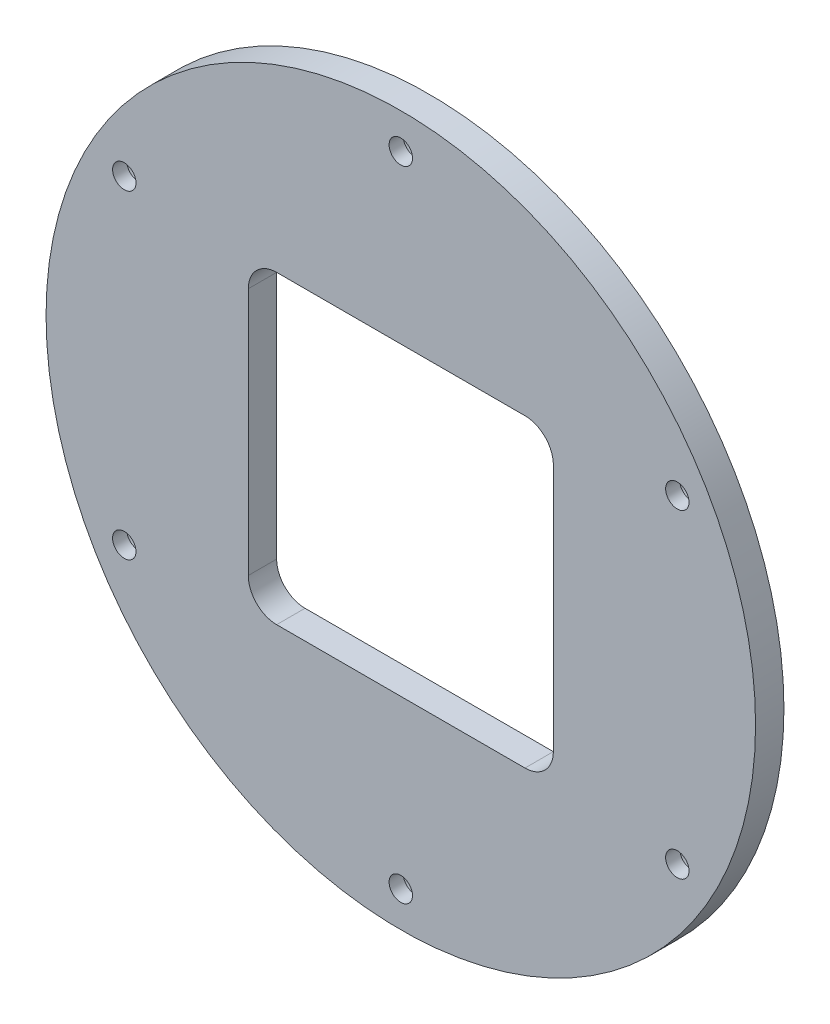
ISO-10303-21;
HEADER;
FILE_DESCRIPTION(('STEP AP214'),'2;1');
FILE_NAME('part.step','',(''),(''),'','','');
FILE_SCHEMA(('AUTOMOTIVE_DESIGN { 1 0 10303 214 1 1 1 1 }'));
ENDSEC;
DATA;
#1=APPLICATION_CONTEXT('core data for automotive mechanical design processes');
#2=APPLICATION_PROTOCOL_DEFINITION('international standard','automotive_design',2000,#1);
#3=PRODUCT_CONTEXT('',#1,'mechanical');
#4=PRODUCT('Part','Part','',(#3));
#5=PRODUCT_RELATED_PRODUCT_CATEGORY('part','',(#4));
#6=PRODUCT_DEFINITION_FORMATION('','',#4);
#7=PRODUCT_DEFINITION_CONTEXT('part definition',#1,'design');
#8=PRODUCT_DEFINITION('design','',#6,#7);
#9=PRODUCT_DEFINITION_SHAPE('','',#8);
#10=(LENGTH_UNIT() NAMED_UNIT(*) SI_UNIT(.MILLI.,.METRE.));
#11=(NAMED_UNIT(*) PLANE_ANGLE_UNIT() SI_UNIT($,.RADIAN.));
#12=(NAMED_UNIT(*) SI_UNIT($,.STERADIAN.) SOLID_ANGLE_UNIT());
#13=UNCERTAINTY_MEASURE_WITH_UNIT(LENGTH_MEASURE(1.E-05),#10,'distance_accuracy_value','');
#14=(GEOMETRIC_REPRESENTATION_CONTEXT(3) GLOBAL_UNCERTAINTY_ASSIGNED_CONTEXT((#13)) GLOBAL_UNIT_ASSIGNED_CONTEXT((#10,
#11,#12)) REPRESENTATION_CONTEXT('',''));
#15=CARTESIAN_POINT('',(0.,0.,0.));
#16=DIRECTION('',(0.,0.,1.));
#17=DIRECTION('',(1.,0.,0.));
#18=AXIS2_PLACEMENT_3D('',#15,#16,#17);
#19=CARTESIAN_POINT('',(0.,0.,4.));
#20=DIRECTION('',(0.,0.,1.));
#21=DIRECTION('',(1.,0.,0.));
#22=AXIS2_PLACEMENT_3D('',#19,#20,#21);
#23=PLANE('',#22);
#24=CARTESIAN_POINT('',(-2.94902990916057E-13,-45.,4.));
#25=DIRECTION('',(0.,0.,1.));
#26=DIRECTION('',(1.,0.,0.));
#27=AXIS2_PLACEMENT_3D('',#24,#25,#26);
#28=CIRCLE('',#27,1.65);
#29=CARTESIAN_POINT('',(1.64999999999971,-45.,4.));
#30=VERTEX_POINT('',#29);
#31=EDGE_CURVE('E209',#30,#30,#28,.T.);
#32=ORIENTED_EDGE('',*,*,#31,.F.);
#33=EDGE_LOOP('',(#32));
#34=FACE_BOUND('',#33,.T.);
#35=CARTESIAN_POINT('',(38.9711431702998,22.4999999999999,4.));
#36=DIRECTION('',(0.,0.,1.));
#37=DIRECTION('',(1.,0.,0.));
#38=AXIS2_PLACEMENT_3D('',#35,#36,#37);
#39=CIRCLE('',#38,1.65);
#40=CARTESIAN_POINT('',(40.6211431702998,22.4999999999999,4.));
#41=VERTEX_POINT('',#40);
#42=EDGE_CURVE('E222',#41,#41,#39,.T.);
#43=ORIENTED_EDGE('',*,*,#42,.F.);
#44=EDGE_LOOP('',(#43));
#45=FACE_BOUND('',#44,.T.);
#46=DIRECTION('',(-1.,0.,0.));
#47=VECTOR('',#46,1.);
#48=CARTESIAN_POINT('',(-21.5,21.5,4.));
#49=LINE('',#48,#47);
#50=CARTESIAN_POINT('',(17.5,21.5,4.));
#51=VERTEX_POINT('',#50);
#52=CARTESIAN_POINT('',(-17.5,21.5,4.));
#53=VERTEX_POINT('',#52);
#54=EDGE_CURVE('E164',#51,#53,#49,.T.);
#55=ORIENTED_EDGE('',*,*,#54,.F.);
#56=CARTESIAN_POINT('',(17.5,17.5,4.));
#57=DIRECTION('',(0.,0.,1.));
#58=DIRECTION('',(1.,0.,0.));
#59=AXIS2_PLACEMENT_3D('',#56,#57,#58);
#60=CIRCLE('',#59,4.);
#61=CARTESIAN_POINT('',(21.5,17.5,4.));
#62=VERTEX_POINT('',#61);
#63=EDGE_CURVE('E115',#51,#62,#60,.F.);
#64=ORIENTED_EDGE('',*,*,#63,.T.);
#65=DIRECTION('',(0.,1.,0.));
#66=VECTOR('',#65,1.);
#67=CARTESIAN_POINT('',(21.5,-21.5,4.));
#68=LINE('',#67,#66);
#69=CARTESIAN_POINT('',(21.5,-17.5,4.));
#70=VERTEX_POINT('',#69);
#71=EDGE_CURVE('E162',#70,#62,#68,.T.);
#72=ORIENTED_EDGE('',*,*,#71,.F.);
#73=CARTESIAN_POINT('',(17.5,-17.5,4.));
#74=DIRECTION('',(0.,0.,1.));
#75=DIRECTION('',(1.,0.,0.));
#76=AXIS2_PLACEMENT_3D('',#73,#74,#75);
#77=CIRCLE('',#76,4.);
#78=CARTESIAN_POINT('',(17.5,-21.5,4.));
#79=VERTEX_POINT('',#78);
#80=EDGE_CURVE('E154',#70,#79,#77,.F.);
#81=ORIENTED_EDGE('',*,*,#80,.T.);
#82=DIRECTION('',(1.,0.,0.));
#83=VECTOR('',#82,1.);
#84=CARTESIAN_POINT('',(-21.5,-21.5,4.));
#85=LINE('',#84,#83);
#86=CARTESIAN_POINT('',(-17.5,-21.5,4.));
#87=VERTEX_POINT('',#86);
#88=EDGE_CURVE('E184',#87,#79,#85,.T.);
#89=ORIENTED_EDGE('',*,*,#88,.F.);
#90=CARTESIAN_POINT('',(-17.5,-17.5,4.));
#91=DIRECTION('',(0.,0.,1.));
#92=DIRECTION('',(1.,0.,0.));
#93=AXIS2_PLACEMENT_3D('',#90,#91,#92);
#94=CIRCLE('',#93,4.);
#95=CARTESIAN_POINT('',(-21.5,-17.5,4.));
#96=VERTEX_POINT('',#95);
#97=EDGE_CURVE('E150',#87,#96,#94,.F.);
#98=ORIENTED_EDGE('',*,*,#97,.T.);
#99=DIRECTION('',(0.,-1.,0.));
#100=VECTOR('',#99,1.);
#101=CARTESIAN_POINT('',(-21.5,-21.5,4.));
#102=LINE('',#101,#100);
#103=CARTESIAN_POINT('',(-21.5,17.5,4.));
#104=VERTEX_POINT('',#103);
#105=EDGE_CURVE('E228',#104,#96,#102,.T.);
#106=ORIENTED_EDGE('',*,*,#105,.F.);
#107=CARTESIAN_POINT('',(-17.5,17.5,4.));
#108=DIRECTION('',(0.,0.,1.));
#109=DIRECTION('',(1.,0.,0.));
#110=AXIS2_PLACEMENT_3D('',#107,#108,#109);
#111=CIRCLE('',#110,4.);
#112=EDGE_CURVE('E11',#104,#53,#111,.F.);
#113=ORIENTED_EDGE('',*,*,#112,.T.);
#114=EDGE_LOOP('',(#55,#64,#72,#81,#89,#98,#106,#113));
#115=FACE_BOUND('',#114,.T.);
#116=CARTESIAN_POINT('',(-38.9711431702998,22.4999999999999,4.));
#117=DIRECTION('',(0.,0.,1.));
#118=DIRECTION('',(1.,0.,0.));
#119=AXIS2_PLACEMENT_3D('',#116,#117,#118);
#120=CIRCLE('',#119,1.65);
#121=CARTESIAN_POINT('',(-37.3211431702998,22.4999999999999,4.));
#122=VERTEX_POINT('',#121);
#123=EDGE_CURVE('E182',#122,#122,#120,.T.);
#124=ORIENTED_EDGE('',*,*,#123,.F.);
#125=EDGE_LOOP('',(#124));
#126=FACE_BOUND('',#125,.T.);
#127=CARTESIAN_POINT('',(0.,0.,4.));
#128=DIRECTION('',(0.,0.,1.));
#129=DIRECTION('',(1.,0.,0.));
#130=AXIS2_PLACEMENT_3D('',#127,#128,#129);
#131=CIRCLE('',#130,50.);
#132=CARTESIAN_POINT('',(50.,0.,4.));
#133=VERTEX_POINT('',#132);
#134=EDGE_CURVE('E125',#133,#133,#131,.T.);
#135=ORIENTED_EDGE('',*,*,#134,.T.);
#136=EDGE_LOOP('',(#135));
#137=FACE_BOUND('',#136,.T.);
#138=CARTESIAN_POINT('',(0.,45.,4.));
#139=DIRECTION('',(0.,0.,1.));
#140=DIRECTION('',(1.,0.,0.));
#141=AXIS2_PLACEMENT_3D('',#138,#139,#140);
#142=CIRCLE('',#141,1.65000000000001);
#143=CARTESIAN_POINT('',(1.64999999999998,45.,4.));
#144=VERTEX_POINT('',#143);
#145=EDGE_CURVE('E177',#144,#144,#142,.T.);
#146=ORIENTED_EDGE('',*,*,#145,.F.);
#147=EDGE_LOOP('',(#146));
#148=FACE_BOUND('',#147,.T.);
#149=CARTESIAN_POINT('',(38.9711431702997,-22.5000000000002,4.));
#150=DIRECTION('',(0.,0.,1.));
#151=DIRECTION('',(1.,0.,0.));
#152=AXIS2_PLACEMENT_3D('',#149,#150,#151);
#153=CIRCLE('',#152,1.65);
#154=CARTESIAN_POINT('',(40.6211431702997,-22.5000000000002,4.));
#155=VERTEX_POINT('',#154);
#156=EDGE_CURVE('E214',#155,#155,#153,.T.);
#157=ORIENTED_EDGE('',*,*,#156,.F.);
#158=EDGE_LOOP('',(#157));
#159=FACE_BOUND('',#158,.T.);
#160=CARTESIAN_POINT('',(-38.9711431702999,-22.4999999999997,4.));
#161=DIRECTION('',(0.,0.,1.));
#162=DIRECTION('',(1.,0.,0.));
#163=AXIS2_PLACEMENT_3D('',#160,#161,#162);
#164=CIRCLE('',#163,1.65);
#165=CARTESIAN_POINT('',(-37.3211431702999,-22.4999999999997,4.));
#166=VERTEX_POINT('',#165);
#167=EDGE_CURVE('E205',#166,#166,#164,.T.);
#168=ORIENTED_EDGE('',*,*,#167,.F.);
#169=EDGE_LOOP('',(#168));
#170=FACE_BOUND('',#169,.T.);
#171=ADVANCED_FACE('F41',(#34,#45,#115,#126,#137,#148,#159,#170),#23,.T.);
#172=CARTESIAN_POINT('',(0.,0.,0.));
#173=DIRECTION('',(0.,0.,1.));
#174=DIRECTION('',(1.,0.,0.));
#175=AXIS2_PLACEMENT_3D('',#172,#173,#174);
#176=PLANE('',#175);
#177=CARTESIAN_POINT('',(0.,45.,0.));
#178=DIRECTION('',(0.,0.,1.));
#179=DIRECTION('',(1.,0.,0.));
#180=AXIS2_PLACEMENT_3D('',#177,#178,#179);
#181=CIRCLE('',#180,3.15);
#182=CARTESIAN_POINT('',(3.14999999999998,45.,0.));
#183=VERTEX_POINT('',#182);
#184=EDGE_CURVE('E516',#183,#183,#181,.T.);
#185=ORIENTED_EDGE('',*,*,#184,.T.);
#186=EDGE_LOOP('',(#185));
#187=FACE_BOUND('',#186,.T.);
#188=CARTESIAN_POINT('',(-38.9711431702995,22.5000000000004,0.));
#189=DIRECTION('',(0.,0.,1.));
#190=DIRECTION('',(1.,0.,0.));
#191=AXIS2_PLACEMENT_3D('',#188,#189,#190);
#192=CIRCLE('',#191,3.15);
#193=CARTESIAN_POINT('',(-35.8211431702995,22.5000000000004,0.));
#194=VERTEX_POINT('',#193);
#195=EDGE_CURVE('E509',#194,#194,#192,.T.);
#196=ORIENTED_EDGE('',*,*,#195,.T.);
#197=EDGE_LOOP('',(#196));
#198=FACE_BOUND('',#197,.T.);
#199=CARTESIAN_POINT('',(-38.9711431702999,-22.4999999999997,0.));
#200=DIRECTION('',(0.,0.,1.));
#201=DIRECTION('',(1.,0.,0.));
#202=AXIS2_PLACEMENT_3D('',#199,#200,#201);
#203=CIRCLE('',#202,3.15);
#204=CARTESIAN_POINT('',(-35.8211431702999,-22.4999999999997,0.));
#205=VERTEX_POINT('',#204);
#206=EDGE_CURVE('E513',#205,#205,#203,.T.);
#207=ORIENTED_EDGE('',*,*,#206,.T.);
#208=EDGE_LOOP('',(#207));
#209=FACE_BOUND('',#208,.T.);
#210=CARTESIAN_POINT('',(-2.9341663878416E-13,-45.,0.));
#211=DIRECTION('',(0.,0.,1.));
#212=DIRECTION('',(1.,0.,0.));
#213=AXIS2_PLACEMENT_3D('',#210,#211,#212);
#214=CIRCLE('',#213,3.15);
#215=CARTESIAN_POINT('',(3.14999999999971,-45.,0.));
#216=VERTEX_POINT('',#215);
#217=EDGE_CURVE('E531',#216,#216,#214,.T.);
#218=ORIENTED_EDGE('',*,*,#217,.T.);
#219=EDGE_LOOP('',(#218));
#220=FACE_BOUND('',#219,.T.);
#221=CARTESIAN_POINT('',(38.9711431702997,-22.5000000000002,0.));
#222=DIRECTION('',(0.,0.,1.));
#223=DIRECTION('',(1.,0.,0.));
#224=AXIS2_PLACEMENT_3D('',#221,#222,#223);
#225=CIRCLE('',#224,3.15);
#226=CARTESIAN_POINT('',(42.1211431702997,-22.5000000000002,0.));
#227=VERTEX_POINT('',#226);
#228=EDGE_CURVE('E525',#227,#227,#225,.T.);
#229=ORIENTED_EDGE('',*,*,#228,.T.);
#230=EDGE_LOOP('',(#229));
#231=FACE_BOUND('',#230,.T.);
#232=CARTESIAN_POINT('',(38.9711431702998,22.4999999999999,0.));
#233=DIRECTION('',(0.,0.,1.));
#234=DIRECTION('',(1.,0.,0.));
#235=AXIS2_PLACEMENT_3D('',#232,#233,#234);
#236=CIRCLE('',#235,3.15);
#237=CARTESIAN_POINT('',(42.1211431702998,22.4999999999999,0.));
#238=VERTEX_POINT('',#237);
#239=EDGE_CURVE('E519',#238,#238,#236,.T.);
#240=ORIENTED_EDGE('',*,*,#239,.T.);
#241=EDGE_LOOP('',(#240));
#242=FACE_BOUND('',#241,.T.);
#243=CARTESIAN_POINT('',(0.,0.,0.));
#244=DIRECTION('',(0.,0.,1.));
#245=DIRECTION('',(1.,0.,0.));
#246=AXIS2_PLACEMENT_3D('',#243,#244,#245);
#247=CIRCLE('',#246,50.);
#248=CARTESIAN_POINT('',(50.,0.,0.));
#249=VERTEX_POINT('',#248);
#250=EDGE_CURVE('E130',#249,#249,#247,.T.);
#251=ORIENTED_EDGE('',*,*,#250,.F.);
#252=EDGE_LOOP('',(#251));
#253=FACE_BOUND('',#252,.T.);
#254=DIRECTION('',(1.,0.,0.));
#255=VECTOR('',#254,1.);
#256=CARTESIAN_POINT('',(-21.5,-21.5,0.));
#257=LINE('',#256,#255);
#258=CARTESIAN_POINT('',(-17.5,-21.5,0.));
#259=VERTEX_POINT('',#258);
#260=CARTESIAN_POINT('',(17.5,-21.5,0.));
#261=VERTEX_POINT('',#260);
#262=EDGE_CURVE('E123',#259,#261,#257,.T.);
#263=ORIENTED_EDGE('',*,*,#262,.T.);
#264=CARTESIAN_POINT('',(17.5,-17.5,0.));
#265=DIRECTION('',(0.,0.,1.));
#266=DIRECTION('',(1.,0.,0.));
#267=AXIS2_PLACEMENT_3D('',#264,#265,#266);
#268=CIRCLE('',#267,4.);
#269=CARTESIAN_POINT('',(21.5,-17.5,0.));
#270=VERTEX_POINT('',#269);
#271=EDGE_CURVE('E152',#261,#270,#268,.T.);
#272=ORIENTED_EDGE('',*,*,#271,.T.);
#273=DIRECTION('',(0.,1.,0.));
#274=VECTOR('',#273,1.);
#275=CARTESIAN_POINT('',(21.5,-21.5,0.));
#276=LINE('',#275,#274);
#277=CARTESIAN_POINT('',(21.5,17.5,0.));
#278=VERTEX_POINT('',#277);
#279=EDGE_CURVE('E174',#270,#278,#276,.T.);
#280=ORIENTED_EDGE('',*,*,#279,.T.);
#281=CARTESIAN_POINT('',(17.5,17.5,0.));
#282=DIRECTION('',(0.,0.,1.));
#283=DIRECTION('',(1.,0.,0.));
#284=AXIS2_PLACEMENT_3D('',#281,#282,#283);
#285=CIRCLE('',#284,4.);
#286=CARTESIAN_POINT('',(17.5,21.5,0.));
#287=VERTEX_POINT('',#286);
#288=EDGE_CURVE('E156',#278,#287,#285,.T.);
#289=ORIENTED_EDGE('',*,*,#288,.T.);
#290=DIRECTION('',(-1.,0.,0.));
#291=VECTOR('',#290,1.);
#292=CARTESIAN_POINT('',(-21.5,21.5,0.));
#293=LINE('',#292,#291);
#294=CARTESIAN_POINT('',(-17.5,21.5,0.));
#295=VERTEX_POINT('',#294);
#296=EDGE_CURVE('E110',#287,#295,#293,.T.);
#297=ORIENTED_EDGE('',*,*,#296,.T.);
#298=CARTESIAN_POINT('',(-17.5,17.5,0.));
#299=DIRECTION('',(0.,0.,1.));
#300=DIRECTION('',(1.,0.,0.));
#301=AXIS2_PLACEMENT_3D('',#298,#299,#300);
#302=CIRCLE('',#301,4.);
#303=CARTESIAN_POINT('',(-21.5,17.5,0.));
#304=VERTEX_POINT('',#303);
#305=EDGE_CURVE('E49',#295,#304,#302,.T.);
#306=ORIENTED_EDGE('',*,*,#305,.T.);
#307=DIRECTION('',(0.,-1.,0.));
#308=VECTOR('',#307,1.);
#309=CARTESIAN_POINT('',(-21.5,-21.5,0.));
#310=LINE('',#309,#308);
#311=CARTESIAN_POINT('',(-21.5,-17.5,0.));
#312=VERTEX_POINT('',#311);
#313=EDGE_CURVE('E109',#304,#312,#310,.T.);
#314=ORIENTED_EDGE('',*,*,#313,.T.);
#315=CARTESIAN_POINT('',(-17.5,-17.5,0.));
#316=DIRECTION('',(0.,0.,1.));
#317=DIRECTION('',(1.,0.,0.));
#318=AXIS2_PLACEMENT_3D('',#315,#316,#317);
#319=CIRCLE('',#318,4.);
#320=EDGE_CURVE('E148',#312,#259,#319,.T.);
#321=ORIENTED_EDGE('',*,*,#320,.T.);
#322=EDGE_LOOP('',(#263,#272,#280,#289,#297,#306,#314,#321));
#323=FACE_BOUND('',#322,.T.);
#324=ADVANCED_FACE('F108',(#187,#198,#209,#220,#231,#242,#253,#323),#176,.F.);
#325=CARTESIAN_POINT('',(0.,0.,4.));
#326=DIRECTION('',(0.,0.,-1.));
#327=DIRECTION('',(-1.,0.,0.));
#328=AXIS2_PLACEMENT_3D('',#325,#326,#327);
#329=CYLINDRICAL_SURFACE('',#328,50.);
#330=ORIENTED_EDGE('',*,*,#134,.F.);
#331=EDGE_LOOP('',(#330));
#332=FACE_BOUND('',#331,.T.);
#333=ORIENTED_EDGE('',*,*,#250,.T.);
#334=EDGE_LOOP('',(#333));
#335=FACE_BOUND('',#334,.T.);
#336=ADVANCED_FACE('F259',(#332,#335),#329,.T.);
#337=CARTESIAN_POINT('',(-38.9711431702998,22.4999999999999,4.));
#338=DIRECTION('',(0.,0.,-1.));
#339=DIRECTION('',(-1.,0.,0.));
#340=AXIS2_PLACEMENT_3D('',#337,#338,#339);
#341=CYLINDRICAL_SURFACE('',#340,1.65);
#342=CARTESIAN_POINT('',(-38.9711431702998,22.4999999999999,2.));
#343=DIRECTION('',(0.,0.,1.));
#344=DIRECTION('',(1.,0.,0.));
#345=AXIS2_PLACEMENT_3D('',#342,#343,#344);
#346=CIRCLE('',#345,1.65);
#347=CARTESIAN_POINT('',(-37.3211431702998,22.4999999999999,2.));
#348=VERTEX_POINT('',#347);
#349=EDGE_CURVE('E133',#348,#348,#346,.T.);
#350=ORIENTED_EDGE('',*,*,#349,.F.);
#351=EDGE_LOOP('',(#350));
#352=FACE_BOUND('',#351,.T.);
#353=ORIENTED_EDGE('',*,*,#123,.T.);
#354=EDGE_LOOP('',(#353));
#355=FACE_BOUND('',#354,.T.);
#356=ADVANCED_FACE('F265',(#352,#355),#341,.F.);
#357=CARTESIAN_POINT('',(21.5,-21.5,4.));
#358=DIRECTION('',(-1.,0.,0.));
#359=DIRECTION('',(0.,0.,1.));
#360=AXIS2_PLACEMENT_3D('',#357,#358,#359);
#361=PLANE('',#360);
#362=ORIENTED_EDGE('',*,*,#279,.F.);
#363=DIRECTION('',(0.,0.,-1.));
#364=VECTOR('',#363,1.);
#365=CARTESIAN_POINT('',(21.5,-17.5,4.));
#366=LINE('',#365,#364);
#367=EDGE_CURVE('E143',#270,#70,#366,.F.);
#368=ORIENTED_EDGE('',*,*,#367,.T.);
#369=ORIENTED_EDGE('',*,*,#71,.T.);
#370=DIRECTION('',(0.,0.,-1.));
#371=VECTOR('',#370,1.);
#372=CARTESIAN_POINT('',(21.5,17.5,0.));
#373=LINE('',#372,#371);
#374=EDGE_CURVE('E140',#62,#278,#373,.T.);
#375=ORIENTED_EDGE('',*,*,#374,.T.);
#376=EDGE_LOOP('',(#362,#368,#369,#375));
#377=FACE_BOUND('',#376,.T.);
#378=ADVANCED_FACE('F169',(#377),#361,.T.);
#379=CARTESIAN_POINT('',(-21.5,21.5,4.));
#380=DIRECTION('',(0.,-1.,0.));
#381=DIRECTION('',(0.,0.,-1.));
#382=AXIS2_PLACEMENT_3D('',#379,#380,#381);
#383=PLANE('',#382);
#384=ORIENTED_EDGE('',*,*,#296,.F.);
#385=DIRECTION('',(0.,0.,-1.));
#386=VECTOR('',#385,1.);
#387=CARTESIAN_POINT('',(17.5,21.5,4.));
#388=LINE('',#387,#386);
#389=EDGE_CURVE('E61',#287,#51,#388,.F.);
#390=ORIENTED_EDGE('',*,*,#389,.T.);
#391=ORIENTED_EDGE('',*,*,#54,.T.);
#392=DIRECTION('',(0.,0.,-1.));
#393=VECTOR('',#392,1.);
#394=CARTESIAN_POINT('',(-17.5,21.5,0.));
#395=LINE('',#394,#393);
#396=EDGE_CURVE('E145',#53,#295,#395,.T.);
#397=ORIENTED_EDGE('',*,*,#396,.T.);
#398=EDGE_LOOP('',(#384,#390,#391,#397));
#399=FACE_BOUND('',#398,.T.);
#400=ADVANCED_FACE('F175',(#399),#383,.T.);
#401=CARTESIAN_POINT('',(-21.5,-21.5,4.));
#402=DIRECTION('',(1.,0.,0.));
#403=DIRECTION('',(0.,0.,-1.));
#404=AXIS2_PLACEMENT_3D('',#401,#402,#403);
#405=PLANE('',#404);
#406=ORIENTED_EDGE('',*,*,#105,.T.);
#407=DIRECTION('',(0.,0.,-1.));
#408=VECTOR('',#407,1.);
#409=CARTESIAN_POINT('',(-21.5,-17.5,0.));
#410=LINE('',#409,#408);
#411=EDGE_CURVE('E122',#96,#312,#410,.T.);
#412=ORIENTED_EDGE('',*,*,#411,.T.);
#413=ORIENTED_EDGE('',*,*,#313,.F.);
#414=DIRECTION('',(0.,0.,-1.));
#415=VECTOR('',#414,1.);
#416=CARTESIAN_POINT('',(-21.5,17.5,4.));
#417=LINE('',#416,#415);
#418=EDGE_CURVE('E120',#304,#104,#417,.F.);
#419=ORIENTED_EDGE('',*,*,#418,.T.);
#420=EDGE_LOOP('',(#406,#412,#413,#419));
#421=FACE_BOUND('',#420,.T.);
#422=ADVANCED_FACE('F119',(#421),#405,.T.);
#423=CARTESIAN_POINT('',(-21.5,-21.5,4.));
#424=DIRECTION('',(0.,1.,0.));
#425=DIRECTION('',(0.,0.,1.));
#426=AXIS2_PLACEMENT_3D('',#423,#424,#425);
#427=PLANE('',#426);
#428=ORIENTED_EDGE('',*,*,#262,.F.);
#429=DIRECTION('',(0.,0.,-1.));
#430=VECTOR('',#429,1.);
#431=CARTESIAN_POINT('',(-17.5,-21.5,4.));
#432=LINE('',#431,#430);
#433=EDGE_CURVE('E138',#259,#87,#432,.F.);
#434=ORIENTED_EDGE('',*,*,#433,.T.);
#435=ORIENTED_EDGE('',*,*,#88,.T.);
#436=DIRECTION('',(0.,0.,-1.));
#437=VECTOR('',#436,1.);
#438=CARTESIAN_POINT('',(17.5,-21.5,0.));
#439=LINE('',#438,#437);
#440=EDGE_CURVE('E127',#79,#261,#439,.T.);
#441=ORIENTED_EDGE('',*,*,#440,.T.);
#442=EDGE_LOOP('',(#428,#434,#435,#441));
#443=FACE_BOUND('',#442,.T.);
#444=ADVANCED_FACE('F234',(#443),#427,.T.);
#445=CARTESIAN_POINT('',(0.,45.,4.));
#446=DIRECTION('',(0.,0.,-1.));
#447=DIRECTION('',(-1.,0.,0.));
#448=AXIS2_PLACEMENT_3D('',#445,#446,#447);
#449=CYLINDRICAL_SURFACE('',#448,1.65000000000001);
#450=CARTESIAN_POINT('',(0.,45.,2.));
#451=DIRECTION('',(0.,0.,1.));
#452=DIRECTION('',(1.,0.,0.));
#453=AXIS2_PLACEMENT_3D('',#450,#451,#452);
#454=CIRCLE('',#453,1.65000000000001);
#455=CARTESIAN_POINT('',(1.64999999999998,45.,2.));
#456=VERTEX_POINT('',#455);
#457=EDGE_CURVE('E200',#456,#456,#454,.T.);
#458=ORIENTED_EDGE('',*,*,#457,.F.);
#459=EDGE_LOOP('',(#458));
#460=FACE_BOUND('',#459,.T.);
#461=ORIENTED_EDGE('',*,*,#145,.T.);
#462=EDGE_LOOP('',(#461));
#463=FACE_BOUND('',#462,.T.);
#464=ADVANCED_FACE('F297',(#460,#463),#449,.F.);
#465=CARTESIAN_POINT('',(38.9711431702998,22.4999999999999,4.));
#466=DIRECTION('',(0.,0.,-1.));
#467=DIRECTION('',(-1.,0.,0.));
#468=AXIS2_PLACEMENT_3D('',#465,#466,#467);
#469=CYLINDRICAL_SURFACE('',#468,1.65);
#470=CARTESIAN_POINT('',(38.9711431702998,22.4999999999999,2.));
#471=DIRECTION('',(0.,0.,1.));
#472=DIRECTION('',(1.,0.,0.));
#473=AXIS2_PLACEMENT_3D('',#470,#471,#472);
#474=CIRCLE('',#473,1.65);
#475=CARTESIAN_POINT('',(40.6211431702998,22.4999999999999,2.));
#476=VERTEX_POINT('',#475);
#477=EDGE_CURVE('E198',#476,#476,#474,.T.);
#478=ORIENTED_EDGE('',*,*,#477,.F.);
#479=EDGE_LOOP('',(#478));
#480=FACE_BOUND('',#479,.T.);
#481=ORIENTED_EDGE('',*,*,#42,.T.);
#482=EDGE_LOOP('',(#481));
#483=FACE_BOUND('',#482,.T.);
#484=ADVANCED_FACE('F287',(#480,#483),#469,.F.);
#485=CARTESIAN_POINT('',(38.9711431702997,-22.5000000000002,4.));
#486=DIRECTION('',(0.,0.,-1.));
#487=DIRECTION('',(-1.,0.,0.));
#488=AXIS2_PLACEMENT_3D('',#485,#486,#487);
#489=CYLINDRICAL_SURFACE('',#488,1.65);
#490=CARTESIAN_POINT('',(38.9711431702997,-22.5000000000002,2.));
#491=DIRECTION('',(0.,0.,1.));
#492=DIRECTION('',(1.,0.,0.));
#493=AXIS2_PLACEMENT_3D('',#490,#491,#492);
#494=CIRCLE('',#493,1.65);
#495=CARTESIAN_POINT('',(40.6211431702997,-22.5000000000002,2.));
#496=VERTEX_POINT('',#495);
#497=EDGE_CURVE('E195',#496,#496,#494,.T.);
#498=ORIENTED_EDGE('',*,*,#497,.F.);
#499=EDGE_LOOP('',(#498));
#500=FACE_BOUND('',#499,.T.);
#501=ORIENTED_EDGE('',*,*,#156,.T.);
#502=EDGE_LOOP('',(#501));
#503=FACE_BOUND('',#502,.T.);
#504=ADVANCED_FACE('F284',(#500,#503),#489,.F.);
#505=CARTESIAN_POINT('',(-2.94902990916057E-13,-45.,4.));
#506=DIRECTION('',(0.,0.,-1.));
#507=DIRECTION('',(-1.,0.,0.));
#508=AXIS2_PLACEMENT_3D('',#505,#506,#507);
#509=CYLINDRICAL_SURFACE('',#508,1.65);
#510=CARTESIAN_POINT('',(-2.94902990916057E-13,-45.,2.));
#511=DIRECTION('',(0.,0.,1.));
#512=DIRECTION('',(1.,0.,0.));
#513=AXIS2_PLACEMENT_3D('',#510,#511,#512);
#514=CIRCLE('',#513,1.65);
#515=CARTESIAN_POINT('',(1.64999999999971,-45.,2.));
#516=VERTEX_POINT('',#515);
#517=EDGE_CURVE('E191',#516,#516,#514,.T.);
#518=ORIENTED_EDGE('',*,*,#517,.F.);
#519=EDGE_LOOP('',(#518));
#520=FACE_BOUND('',#519,.T.);
#521=ORIENTED_EDGE('',*,*,#31,.T.);
#522=EDGE_LOOP('',(#521));
#523=FACE_BOUND('',#522,.T.);
#524=ADVANCED_FACE('F286',(#520,#523),#509,.F.);
#525=CARTESIAN_POINT('',(-38.9711431702999,-22.4999999999997,4.));
#526=DIRECTION('',(0.,0.,-1.));
#527=DIRECTION('',(-1.,0.,0.));
#528=AXIS2_PLACEMENT_3D('',#525,#526,#527);
#529=CYLINDRICAL_SURFACE('',#528,1.65);
#530=CARTESIAN_POINT('',(-38.9711431702999,-22.4999999999997,2.));
#531=DIRECTION('',(0.,0.,1.));
#532=DIRECTION('',(1.,0.,0.));
#533=AXIS2_PLACEMENT_3D('',#530,#531,#532);
#534=CIRCLE('',#533,1.65);
#535=CARTESIAN_POINT('',(-37.3211431702999,-22.4999999999997,2.));
#536=VERTEX_POINT('',#535);
#537=EDGE_CURVE('E188',#536,#536,#534,.T.);
#538=ORIENTED_EDGE('',*,*,#537,.F.);
#539=EDGE_LOOP('',(#538));
#540=FACE_BOUND('',#539,.T.);
#541=ORIENTED_EDGE('',*,*,#167,.T.);
#542=EDGE_LOOP('',(#541));
#543=FACE_BOUND('',#542,.T.);
#544=ADVANCED_FACE('F294',(#540,#543),#529,.F.);
#545=CARTESIAN_POINT('',(-38.9711431702999,-22.4999999999997,2.));
#546=DIRECTION('',(0.,0.,-1.));
#547=DIRECTION('',(-1.,0.,0.));
#548=AXIS2_PLACEMENT_3D('',#545,#546,#547);
#549=CYLINDRICAL_SURFACE('',#548,3.15);
#550=CARTESIAN_POINT('',(-38.9711431702999,-22.4999999999997,2.));
#551=DIRECTION('',(0.,0.,1.));
#552=DIRECTION('',(1.,0.,0.));
#553=AXIS2_PLACEMENT_3D('',#550,#551,#552);
#554=CIRCLE('',#553,3.15);
#555=CARTESIAN_POINT('',(-35.8211431702999,-22.4999999999997,2.));
#556=VERTEX_POINT('',#555);
#557=EDGE_CURVE('E217',#556,#556,#554,.T.);
#558=ORIENTED_EDGE('',*,*,#557,.T.);
#559=EDGE_LOOP('',(#558));
#560=FACE_BOUND('',#559,.T.);
#561=ORIENTED_EDGE('',*,*,#206,.F.);
#562=EDGE_LOOP('',(#561));
#563=FACE_BOUND('',#562,.T.);
#564=ADVANCED_FACE('F363',(#560,#563),#549,.F.);
#565=CARTESIAN_POINT('',(-38.9711431702999,-22.4999999999997,2.));
#566=DIRECTION('',(0.,0.,1.));
#567=DIRECTION('',(1.,0.,0.));
#568=AXIS2_PLACEMENT_3D('',#565,#566,#567);
#569=PLANE('',#568);
#570=ORIENTED_EDGE('',*,*,#537,.T.);
#571=EDGE_LOOP('',(#570));
#572=FACE_BOUND('',#571,.T.);
#573=ORIENTED_EDGE('',*,*,#557,.F.);
#574=EDGE_LOOP('',(#573));
#575=FACE_BOUND('',#574,.T.);
#576=ADVANCED_FACE('F372',(#572,#575),#569,.F.);
#577=CARTESIAN_POINT('',(-2.9341663878416E-13,-45.,2.));
#578=DIRECTION('',(0.,0.,-1.));
#579=DIRECTION('',(-1.,0.,0.));
#580=AXIS2_PLACEMENT_3D('',#577,#578,#579);
#581=CYLINDRICAL_SURFACE('',#580,3.15);
#582=CARTESIAN_POINT('',(-2.9341663878416E-13,-45.,2.));
#583=DIRECTION('',(0.,0.,1.));
#584=DIRECTION('',(1.,0.,0.));
#585=AXIS2_PLACEMENT_3D('',#582,#583,#584);
#586=CIRCLE('',#585,3.15);
#587=CARTESIAN_POINT('',(3.14999999999971,-45.,2.));
#588=VERTEX_POINT('',#587);
#589=EDGE_CURVE('E534',#588,#588,#586,.T.);
#590=ORIENTED_EDGE('',*,*,#589,.T.);
#591=EDGE_LOOP('',(#590));
#592=FACE_BOUND('',#591,.T.);
#593=ORIENTED_EDGE('',*,*,#217,.F.);
#594=EDGE_LOOP('',(#593));
#595=FACE_BOUND('',#594,.T.);
#596=ADVANCED_FACE('F382',(#592,#595),#581,.F.);
#597=CARTESIAN_POINT('',(-2.9341663878416E-13,-45.,2.));
#598=DIRECTION('',(0.,0.,1.));
#599=DIRECTION('',(1.,0.,0.));
#600=AXIS2_PLACEMENT_3D('',#597,#598,#599);
#601=PLANE('',#600);
#602=ORIENTED_EDGE('',*,*,#517,.T.);
#603=EDGE_LOOP('',(#602));
#604=FACE_BOUND('',#603,.T.);
#605=ORIENTED_EDGE('',*,*,#589,.F.);
#606=EDGE_LOOP('',(#605));
#607=FACE_BOUND('',#606,.T.);
#608=ADVANCED_FACE('F392',(#604,#607),#601,.F.);
#609=CARTESIAN_POINT('',(38.9711431702997,-22.5000000000002,2.));
#610=DIRECTION('',(0.,0.,-1.));
#611=DIRECTION('',(-1.,0.,0.));
#612=AXIS2_PLACEMENT_3D('',#609,#610,#611);
#613=CYLINDRICAL_SURFACE('',#612,3.15);
#614=CARTESIAN_POINT('',(38.9711431702997,-22.5000000000002,2.));
#615=DIRECTION('',(0.,0.,1.));
#616=DIRECTION('',(1.,0.,0.));
#617=AXIS2_PLACEMENT_3D('',#614,#615,#616);
#618=CIRCLE('',#617,3.15);
#619=CARTESIAN_POINT('',(42.1211431702997,-22.5000000000002,2.));
#620=VERTEX_POINT('',#619);
#621=EDGE_CURVE('E528',#620,#620,#618,.T.);
#622=ORIENTED_EDGE('',*,*,#621,.T.);
#623=EDGE_LOOP('',(#622));
#624=FACE_BOUND('',#623,.T.);
#625=ORIENTED_EDGE('',*,*,#228,.F.);
#626=EDGE_LOOP('',(#625));
#627=FACE_BOUND('',#626,.T.);
#628=ADVANCED_FACE('F402',(#624,#627),#613,.F.);
#629=CARTESIAN_POINT('',(38.9711431702997,-22.5000000000002,2.));
#630=DIRECTION('',(0.,0.,1.));
#631=DIRECTION('',(1.,0.,0.));
#632=AXIS2_PLACEMENT_3D('',#629,#630,#631);
#633=PLANE('',#632);
#634=ORIENTED_EDGE('',*,*,#497,.T.);
#635=EDGE_LOOP('',(#634));
#636=FACE_BOUND('',#635,.T.);
#637=ORIENTED_EDGE('',*,*,#621,.F.);
#638=EDGE_LOOP('',(#637));
#639=FACE_BOUND('',#638,.T.);
#640=ADVANCED_FACE('F412',(#636,#639),#633,.F.);
#641=CARTESIAN_POINT('',(38.9711431702998,22.4999999999999,2.));
#642=DIRECTION('',(0.,0.,-1.));
#643=DIRECTION('',(-1.,0.,0.));
#644=AXIS2_PLACEMENT_3D('',#641,#642,#643);
#645=CYLINDRICAL_SURFACE('',#644,3.15);
#646=CARTESIAN_POINT('',(38.9711431702998,22.4999999999999,2.));
#647=DIRECTION('',(0.,0.,1.));
#648=DIRECTION('',(1.,0.,0.));
#649=AXIS2_PLACEMENT_3D('',#646,#647,#648);
#650=CIRCLE('',#649,3.15);
#651=CARTESIAN_POINT('',(42.1211431702998,22.4999999999999,2.));
#652=VERTEX_POINT('',#651);
#653=EDGE_CURVE('E522',#652,#652,#650,.T.);
#654=ORIENTED_EDGE('',*,*,#653,.T.);
#655=EDGE_LOOP('',(#654));
#656=FACE_BOUND('',#655,.T.);
#657=ORIENTED_EDGE('',*,*,#239,.F.);
#658=EDGE_LOOP('',(#657));
#659=FACE_BOUND('',#658,.T.);
#660=ADVANCED_FACE('F422',(#656,#659),#645,.F.);
#661=CARTESIAN_POINT('',(38.9711431702998,22.4999999999999,2.));
#662=DIRECTION('',(0.,0.,1.));
#663=DIRECTION('',(1.,0.,0.));
#664=AXIS2_PLACEMENT_3D('',#661,#662,#663);
#665=PLANE('',#664);
#666=ORIENTED_EDGE('',*,*,#477,.T.);
#667=EDGE_LOOP('',(#666));
#668=FACE_BOUND('',#667,.T.);
#669=ORIENTED_EDGE('',*,*,#653,.F.);
#670=EDGE_LOOP('',(#669));
#671=FACE_BOUND('',#670,.T.);
#672=ADVANCED_FACE('F432',(#668,#671),#665,.F.);
#673=CARTESIAN_POINT('',(0.,45.,2.));
#674=DIRECTION('',(0.,0.,-1.));
#675=DIRECTION('',(-1.,0.,0.));
#676=AXIS2_PLACEMENT_3D('',#673,#674,#675);
#677=CYLINDRICAL_SURFACE('',#676,3.15);
#678=CARTESIAN_POINT('',(0.,45.,2.));
#679=DIRECTION('',(0.,0.,1.));
#680=DIRECTION('',(1.,0.,0.));
#681=AXIS2_PLACEMENT_3D('',#678,#679,#680);
#682=CIRCLE('',#681,3.15);
#683=CARTESIAN_POINT('',(3.14999999999998,45.,2.));
#684=VERTEX_POINT('',#683);
#685=EDGE_CURVE('E192',#684,#684,#682,.T.);
#686=ORIENTED_EDGE('',*,*,#685,.T.);
#687=EDGE_LOOP('',(#686));
#688=FACE_BOUND('',#687,.T.);
#689=ORIENTED_EDGE('',*,*,#184,.F.);
#690=EDGE_LOOP('',(#689));
#691=FACE_BOUND('',#690,.T.);
#692=ADVANCED_FACE('F442',(#688,#691),#677,.F.);
#693=CARTESIAN_POINT('',(0.,45.,2.));
#694=DIRECTION('',(0.,0.,1.));
#695=DIRECTION('',(1.,0.,0.));
#696=AXIS2_PLACEMENT_3D('',#693,#694,#695);
#697=PLANE('',#696);
#698=ORIENTED_EDGE('',*,*,#457,.T.);
#699=EDGE_LOOP('',(#698));
#700=FACE_BOUND('',#699,.T.);
#701=ORIENTED_EDGE('',*,*,#685,.F.);
#702=EDGE_LOOP('',(#701));
#703=FACE_BOUND('',#702,.T.);
#704=ADVANCED_FACE('F452',(#700,#703),#697,.F.);
#705=CARTESIAN_POINT('',(-38.9711431702995,22.5000000000004,2.));
#706=DIRECTION('',(0.,0.,-1.));
#707=DIRECTION('',(-1.,0.,0.));
#708=AXIS2_PLACEMENT_3D('',#705,#706,#707);
#709=CYLINDRICAL_SURFACE('',#708,3.15);
#710=CARTESIAN_POINT('',(-38.9711431702995,22.5000000000004,2.));
#711=DIRECTION('',(0.,0.,1.));
#712=DIRECTION('',(1.,0.,0.));
#713=AXIS2_PLACEMENT_3D('',#710,#711,#712);
#714=CIRCLE('',#713,3.15);
#715=CARTESIAN_POINT('',(-35.8211431702995,22.5000000000004,2.));
#716=VERTEX_POINT('',#715);
#717=EDGE_CURVE('E506',#716,#716,#714,.T.);
#718=ORIENTED_EDGE('',*,*,#717,.T.);
#719=EDGE_LOOP('',(#718));
#720=FACE_BOUND('',#719,.T.);
#721=ORIENTED_EDGE('',*,*,#195,.F.);
#722=EDGE_LOOP('',(#721));
#723=FACE_BOUND('',#722,.T.);
#724=ADVANCED_FACE('F250',(#720,#723),#709,.F.);
#725=CARTESIAN_POINT('',(-38.9711431702995,22.5000000000004,2.));
#726=DIRECTION('',(0.,0.,1.));
#727=DIRECTION('',(1.,0.,0.));
#728=AXIS2_PLACEMENT_3D('',#725,#726,#727);
#729=PLANE('',#728);
#730=ORIENTED_EDGE('',*,*,#349,.T.);
#731=EDGE_LOOP('',(#730));
#732=FACE_BOUND('',#731,.T.);
#733=ORIENTED_EDGE('',*,*,#717,.F.);
#734=EDGE_LOOP('',(#733));
#735=FACE_BOUND('',#734,.T.);
#736=ADVANCED_FACE('F242',(#732,#735),#729,.F.);
#737=CARTESIAN_POINT('',(-17.5,-17.5,4.));
#738=DIRECTION('',(0.,0.,1.));
#739=DIRECTION('',(1.,0.,0.));
#740=AXIS2_PLACEMENT_3D('',#737,#738,#739);
#741=CYLINDRICAL_SURFACE('',#740,4.);
#742=ORIENTED_EDGE('',*,*,#97,.F.);
#743=ORIENTED_EDGE('',*,*,#433,.F.);
#744=ORIENTED_EDGE('',*,*,#320,.F.);
#745=ORIENTED_EDGE('',*,*,#411,.F.);
#746=EDGE_LOOP('',(#742,#743,#744,#745));
#747=FACE_BOUND('',#746,.T.);
#748=ADVANCED_FACE('F240',(#747),#741,.F.);
#749=CARTESIAN_POINT('',(17.5,-17.5,4.));
#750=DIRECTION('',(0.,0.,1.));
#751=DIRECTION('',(1.,0.,0.));
#752=AXIS2_PLACEMENT_3D('',#749,#750,#751);
#753=CYLINDRICAL_SURFACE('',#752,4.);
#754=ORIENTED_EDGE('',*,*,#80,.F.);
#755=ORIENTED_EDGE('',*,*,#367,.F.);
#756=ORIENTED_EDGE('',*,*,#271,.F.);
#757=ORIENTED_EDGE('',*,*,#440,.F.);
#758=EDGE_LOOP('',(#754,#755,#756,#757));
#759=FACE_BOUND('',#758,.T.);
#760=ADVANCED_FACE('F238',(#759),#753,.F.);
#761=CARTESIAN_POINT('',(17.5,17.5,4.));
#762=DIRECTION('',(0.,0.,1.));
#763=DIRECTION('',(1.,0.,0.));
#764=AXIS2_PLACEMENT_3D('',#761,#762,#763);
#765=CYLINDRICAL_SURFACE('',#764,4.);
#766=ORIENTED_EDGE('',*,*,#63,.F.);
#767=ORIENTED_EDGE('',*,*,#389,.F.);
#768=ORIENTED_EDGE('',*,*,#288,.F.);
#769=ORIENTED_EDGE('',*,*,#374,.F.);
#770=EDGE_LOOP('',(#766,#767,#768,#769));
#771=FACE_BOUND('',#770,.T.);
#772=ADVANCED_FACE('F173',(#771),#765,.F.);
#773=CARTESIAN_POINT('',(-17.5,17.5,4.));
#774=DIRECTION('',(0.,0.,1.));
#775=DIRECTION('',(1.,0.,0.));
#776=AXIS2_PLACEMENT_3D('',#773,#774,#775);
#777=CYLINDRICAL_SURFACE('',#776,4.);
#778=ORIENTED_EDGE('',*,*,#112,.F.);
#779=ORIENTED_EDGE('',*,*,#418,.F.);
#780=ORIENTED_EDGE('',*,*,#305,.F.);
#781=ORIENTED_EDGE('',*,*,#396,.F.);
#782=EDGE_LOOP('',(#778,#779,#780,#781));
#783=FACE_BOUND('',#782,.T.);
#784=ADVANCED_FACE('F43',(#783),#777,.F.);
#785=CLOSED_SHELL('',(#171,#324,#336,#356,#378,#400,#422,#444,#464,#484,#504,#524,#544,#564,
#576,#596,#608,#628,#640,#660,#672,#692,#704,#724,#736,#748,#760,#772,#784));
#786=MANIFOLD_SOLID_BREP('B2',#785);
#787=ADVANCED_BREP_SHAPE_REPRESENTATION('',(#18,#786),#14);
#788=SHAPE_DEFINITION_REPRESENTATION(#9,#787);
ENDSEC;
END-ISO-10303-21;
